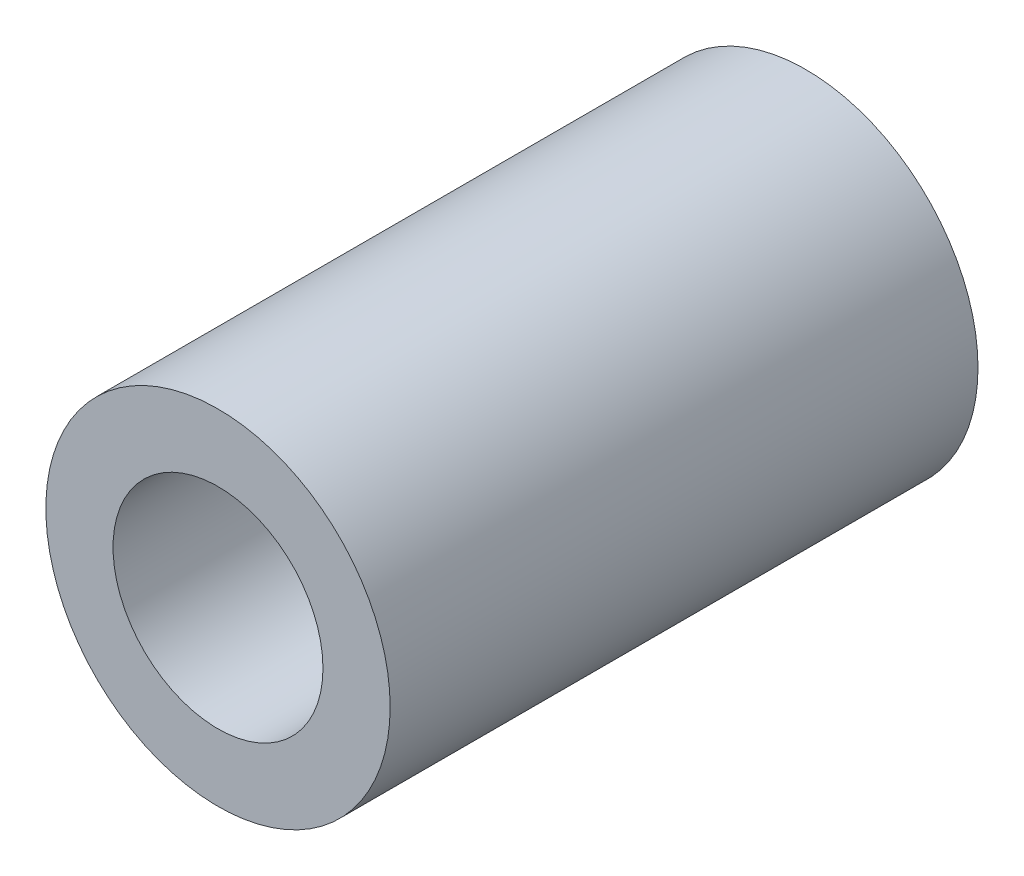
ISO-10303-21;
HEADER;
FILE_DESCRIPTION(('STEP AP214'),'2;1');
FILE_NAME('part.step','',(''),(''),'','','');
FILE_SCHEMA(('AUTOMOTIVE_DESIGN { 1 0 10303 214 1 1 1 1 }'));
ENDSEC;
DATA;
#1=APPLICATION_CONTEXT('core data for automotive mechanical design processes');
#2=APPLICATION_PROTOCOL_DEFINITION('international standard','automotive_design',2000,#1);
#3=PRODUCT_CONTEXT('',#1,'mechanical');
#4=PRODUCT('Part','Part','',(#3));
#5=PRODUCT_RELATED_PRODUCT_CATEGORY('part','',(#4));
#6=PRODUCT_DEFINITION_FORMATION('','',#4);
#7=PRODUCT_DEFINITION_CONTEXT('part definition',#1,'design');
#8=PRODUCT_DEFINITION('design','',#6,#7);
#9=PRODUCT_DEFINITION_SHAPE('','',#8);
#10=(LENGTH_UNIT() NAMED_UNIT(*) SI_UNIT(.MILLI.,.METRE.));
#11=(NAMED_UNIT(*) PLANE_ANGLE_UNIT() SI_UNIT($,.RADIAN.));
#12=(NAMED_UNIT(*) SI_UNIT($,.STERADIAN.) SOLID_ANGLE_UNIT());
#13=UNCERTAINTY_MEASURE_WITH_UNIT(LENGTH_MEASURE(1.E-05),#10,'distance_accuracy_value','');
#14=(GEOMETRIC_REPRESENTATION_CONTEXT(3) GLOBAL_UNCERTAINTY_ASSIGNED_CONTEXT((#13)) GLOBAL_UNIT_ASSIGNED_CONTEXT((#10,
#11,#12)) REPRESENTATION_CONTEXT('',''));
#15=CARTESIAN_POINT('',(0.,0.,0.));
#16=DIRECTION('',(0.,0.,1.));
#17=DIRECTION('',(1.,0.,0.));
#18=AXIS2_PLACEMENT_3D('',#15,#16,#17);
#19=CARTESIAN_POINT('',(0.,0.,70.));
#20=DIRECTION('',(0.,0.,1.));
#21=DIRECTION('',(1.,0.,0.));
#22=AXIS2_PLACEMENT_3D('',#19,#20,#21);
#23=PLANE('',#22);
#24=CARTESIAN_POINT('',(0.,0.,70.));
#25=DIRECTION('',(0.,0.,1.));
#26=DIRECTION('',(1.,0.,0.));
#27=AXIS2_PLACEMENT_3D('',#24,#25,#26);
#28=CIRCLE('',#27,20.5);
#29=CARTESIAN_POINT('',(20.5,0.,70.));
#30=VERTEX_POINT('',#29);
#31=EDGE_CURVE('E10',#30,#30,#28,.T.);
#32=ORIENTED_EDGE('',*,*,#31,.T.);
#33=EDGE_LOOP('',(#32));
#34=FACE_BOUND('',#33,.T.);
#35=CARTESIAN_POINT('',(0.,0.,70.));
#36=DIRECTION('',(0.,0.,1.));
#37=DIRECTION('',(1.,0.,0.));
#38=AXIS2_PLACEMENT_3D('',#35,#36,#37);
#39=CIRCLE('',#38,12.5);
#40=CARTESIAN_POINT('',(12.5,0.,70.));
#41=VERTEX_POINT('',#40);
#42=EDGE_CURVE('E57',#41,#41,#39,.T.);
#43=ORIENTED_EDGE('',*,*,#42,.F.);
#44=EDGE_LOOP('',(#43));
#45=FACE_BOUND('',#44,.T.);
#46=ADVANCED_FACE('F43',(#34,#45),#23,.T.);
#47=CARTESIAN_POINT('',(0.,0.,0.));
#48=DIRECTION('',(0.,0.,1.));
#49=DIRECTION('',(1.,0.,0.));
#50=AXIS2_PLACEMENT_3D('',#47,#48,#49);
#51=PLANE('',#50);
#52=CARTESIAN_POINT('',(0.,0.,0.));
#53=DIRECTION('',(0.,0.,1.));
#54=DIRECTION('',(1.,0.,0.));
#55=AXIS2_PLACEMENT_3D('',#52,#53,#54);
#56=CIRCLE('',#55,20.5);
#57=CARTESIAN_POINT('',(20.5,0.,0.));
#58=VERTEX_POINT('',#57);
#59=EDGE_CURVE('E48',#58,#58,#56,.T.);
#60=ORIENTED_EDGE('',*,*,#59,.F.);
#61=EDGE_LOOP('',(#60));
#62=FACE_BOUND('',#61,.T.);
#63=CARTESIAN_POINT('',(0.,0.,0.));
#64=DIRECTION('',(0.,0.,1.));
#65=DIRECTION('',(1.,0.,0.));
#66=AXIS2_PLACEMENT_3D('',#63,#64,#65);
#67=CIRCLE('',#66,12.5);
#68=CARTESIAN_POINT('',(12.5,0.,0.));
#69=VERTEX_POINT('',#68);
#70=EDGE_CURVE('E59',#69,#69,#67,.T.);
#71=ORIENTED_EDGE('',*,*,#70,.T.);
#72=EDGE_LOOP('',(#71));
#73=FACE_BOUND('',#72,.T.);
#74=ADVANCED_FACE('F71',(#62,#73),#51,.F.);
#75=CARTESIAN_POINT('',(0.,0.,70.));
#76=DIRECTION('',(0.,0.,-1.));
#77=DIRECTION('',(-1.,0.,0.));
#78=AXIS2_PLACEMENT_3D('',#75,#76,#77);
#79=CYLINDRICAL_SURFACE('',#78,20.5);
#80=ORIENTED_EDGE('',*,*,#31,.F.);
#81=EDGE_LOOP('',(#80));
#82=FACE_BOUND('',#81,.T.);
#83=ORIENTED_EDGE('',*,*,#59,.T.);
#84=EDGE_LOOP('',(#83));
#85=FACE_BOUND('',#84,.T.);
#86=ADVANCED_FACE('F46',(#82,#85),#79,.T.);
#87=CARTESIAN_POINT('',(0.,0.,70.));
#88=DIRECTION('',(0.,0.,-1.));
#89=DIRECTION('',(-1.,0.,0.));
#90=AXIS2_PLACEMENT_3D('',#87,#88,#89);
#91=CYLINDRICAL_SURFACE('',#90,12.5);
#92=ORIENTED_EDGE('',*,*,#42,.T.);
#93=EDGE_LOOP('',(#92));
#94=FACE_BOUND('',#93,.T.);
#95=ORIENTED_EDGE('',*,*,#70,.F.);
#96=EDGE_LOOP('',(#95));
#97=FACE_BOUND('',#96,.T.);
#98=ADVANCED_FACE('F67',(#94,#97),#91,.F.);
#99=CLOSED_SHELL('',(#46,#74,#86,#98));
#100=MANIFOLD_SOLID_BREP('B2',#99);
#101=ADVANCED_BREP_SHAPE_REPRESENTATION('',(#18,#100),#14);
#102=SHAPE_DEFINITION_REPRESENTATION(#9,#101);
ENDSEC;
END-ISO-10303-21;
